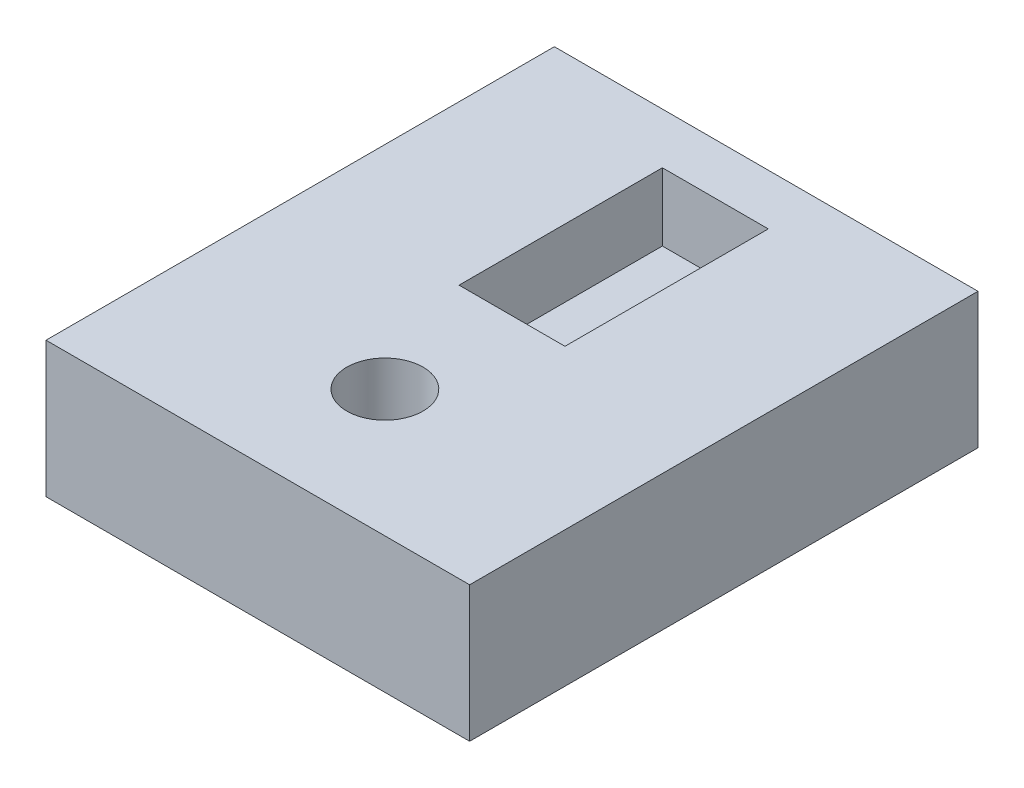
ISO-10303-21;
HEADER;
FILE_DESCRIPTION(('STEP AP214'),'2;1');
FILE_NAME('part.step','',(''),(''),'','','');
FILE_SCHEMA(('AUTOMOTIVE_DESIGN { 1 0 10303 214 1 1 1 1 }'));
ENDSEC;
DATA;
#1=APPLICATION_CONTEXT('core data for automotive mechanical design processes');
#2=APPLICATION_PROTOCOL_DEFINITION('international standard','automotive_design',2000,#1);
#3=PRODUCT_CONTEXT('',#1,'mechanical');
#4=PRODUCT('Part','Part','',(#3));
#5=PRODUCT_RELATED_PRODUCT_CATEGORY('part','',(#4));
#6=PRODUCT_DEFINITION_FORMATION('','',#4);
#7=PRODUCT_DEFINITION_CONTEXT('part definition',#1,'design');
#8=PRODUCT_DEFINITION('design','',#6,#7);
#9=PRODUCT_DEFINITION_SHAPE('','',#8);
#10=(LENGTH_UNIT() NAMED_UNIT(*) SI_UNIT(.MILLI.,.METRE.));
#11=(NAMED_UNIT(*) PLANE_ANGLE_UNIT() SI_UNIT($,.RADIAN.));
#12=(NAMED_UNIT(*) SI_UNIT($,.STERADIAN.) SOLID_ANGLE_UNIT());
#13=UNCERTAINTY_MEASURE_WITH_UNIT(LENGTH_MEASURE(1.E-05),#10,'distance_accuracy_value','');
#14=(GEOMETRIC_REPRESENTATION_CONTEXT(3) GLOBAL_UNCERTAINTY_ASSIGNED_CONTEXT((#13)) GLOBAL_UNIT_ASSIGNED_CONTEXT((#10,
#11,#12)) REPRESENTATION_CONTEXT('',''));
#15=CARTESIAN_POINT('',(0.,0.,0.));
#16=DIRECTION('',(0.,0.,1.));
#17=DIRECTION('',(1.,0.,0.));
#18=AXIS2_PLACEMENT_3D('',#15,#16,#17);
#19=CARTESIAN_POINT('',(-12.5,4.,15.));
#20=DIRECTION('',(1.,0.,0.));
#21=DIRECTION('',(0.,0.,-1.));
#22=AXIS2_PLACEMENT_3D('',#19,#20,#21);
#23=PLANE('',#22);
#24=DIRECTION('',(0.,-1.,0.));
#25=VECTOR('',#24,1.);
#26=CARTESIAN_POINT('',(-12.5,4.,-15.));
#27=LINE('',#26,#25);
#28=CARTESIAN_POINT('',(-12.5,4.,-15.));
#29=VERTEX_POINT('',#28);
#30=CARTESIAN_POINT('',(-12.5,-4.,-15.));
#31=VERTEX_POINT('',#30);
#32=EDGE_CURVE('E149',#29,#31,#27,.T.);
#33=ORIENTED_EDGE('',*,*,#32,.T.);
#34=DIRECTION('',(0.,0.,-1.));
#35=VECTOR('',#34,1.);
#36=CARTESIAN_POINT('',(-12.5,-4.,15.));
#37=LINE('',#36,#35);
#38=CARTESIAN_POINT('',(-12.5,-4.,15.));
#39=VERTEX_POINT('',#38);
#40=EDGE_CURVE('E11',#39,#31,#37,.T.);
#41=ORIENTED_EDGE('',*,*,#40,.F.);
#42=DIRECTION('',(0.,-1.,0.));
#43=VECTOR('',#42,1.);
#44=CARTESIAN_POINT('',(-12.5,4.,15.));
#45=LINE('',#44,#43);
#46=CARTESIAN_POINT('',(-12.5,4.,15.));
#47=VERTEX_POINT('',#46);
#48=EDGE_CURVE('E154',#47,#39,#45,.T.);
#49=ORIENTED_EDGE('',*,*,#48,.F.);
#50=DIRECTION('',(0.,0.,-1.));
#51=VECTOR('',#50,1.);
#52=CARTESIAN_POINT('',(-12.5,4.,15.));
#53=LINE('',#52,#51);
#54=EDGE_CURVE('E160',#47,#29,#53,.T.);
#55=ORIENTED_EDGE('',*,*,#54,.T.);
#56=EDGE_LOOP('',(#33,#41,#49,#55));
#57=FACE_BOUND('',#56,.T.);
#58=ADVANCED_FACE('F37',(#57),#23,.F.);
#59=CARTESIAN_POINT('',(-12.5,-4.,15.));
#60=DIRECTION('',(0.,1.,0.));
#61=DIRECTION('',(0.,0.,1.));
#62=AXIS2_PLACEMENT_3D('',#59,#60,#61);
#63=PLANE('',#62);
#64=CARTESIAN_POINT('',(0.,-4.,7.5));
#65=DIRECTION('',(0.,-1.,0.));
#66=DIRECTION('',(0.,0.,-1.));
#67=AXIS2_PLACEMENT_3D('',#64,#65,#66);
#68=CIRCLE('',#67,2.25);
#69=CARTESIAN_POINT('',(0.,-4.,5.25));
#70=VERTEX_POINT('',#69);
#71=EDGE_CURVE('E206',#70,#70,#68,.T.);
#72=ORIENTED_EDGE('',*,*,#71,.F.);
#73=EDGE_LOOP('',(#72));
#74=FACE_BOUND('',#73,.T.);
#75=DIRECTION('',(1.,0.,0.));
#76=VECTOR('',#75,1.);
#77=CARTESIAN_POINT('',(-12.5,-4.,-15.));
#78=LINE('',#77,#76);
#79=CARTESIAN_POINT('',(12.5,-4.,-15.));
#80=VERTEX_POINT('',#79);
#81=EDGE_CURVE('E163',#31,#80,#78,.T.);
#82=ORIENTED_EDGE('',*,*,#81,.T.);
#83=DIRECTION('',(0.,0.,-1.));
#84=VECTOR('',#83,1.);
#85=CARTESIAN_POINT('',(12.5,-4.,15.));
#86=LINE('',#85,#84);
#87=CARTESIAN_POINT('',(12.5,-4.,15.));
#88=VERTEX_POINT('',#87);
#89=EDGE_CURVE('E44',#88,#80,#86,.T.);
#90=ORIENTED_EDGE('',*,*,#89,.F.);
#91=DIRECTION('',(1.,0.,0.));
#92=VECTOR('',#91,1.);
#93=CARTESIAN_POINT('',(-12.5,-4.,15.));
#94=LINE('',#93,#92);
#95=EDGE_CURVE('E88',#39,#88,#94,.T.);
#96=ORIENTED_EDGE('',*,*,#95,.F.);
#97=ORIENTED_EDGE('',*,*,#40,.T.);
#98=EDGE_LOOP('',(#82,#90,#96,#97));
#99=FACE_BOUND('',#98,.T.);
#100=ADVANCED_FACE('F192',(#74,#99),#63,.F.);
#101=CARTESIAN_POINT('',(12.5,4.,15.));
#102=DIRECTION('',(-1.,0.,0.));
#103=DIRECTION('',(0.,0.,1.));
#104=AXIS2_PLACEMENT_3D('',#101,#102,#103);
#105=PLANE('',#104);
#106=DIRECTION('',(0.,1.,0.));
#107=VECTOR('',#106,1.);
#108=CARTESIAN_POINT('',(12.5,4.,-15.));
#109=LINE('',#108,#107);
#110=CARTESIAN_POINT('',(12.5,4.,-15.));
#111=VERTEX_POINT('',#110);
#112=EDGE_CURVE('E165',#80,#111,#109,.T.);
#113=ORIENTED_EDGE('',*,*,#112,.T.);
#114=DIRECTION('',(0.,0.,-1.));
#115=VECTOR('',#114,1.);
#116=CARTESIAN_POINT('',(12.5,4.,15.));
#117=LINE('',#116,#115);
#118=CARTESIAN_POINT('',(12.5,4.,15.));
#119=VERTEX_POINT('',#118);
#120=EDGE_CURVE('E169',#119,#111,#117,.T.);
#121=ORIENTED_EDGE('',*,*,#120,.F.);
#122=DIRECTION('',(0.,1.,0.));
#123=VECTOR('',#122,1.);
#124=CARTESIAN_POINT('',(12.5,4.,15.));
#125=LINE('',#124,#123);
#126=EDGE_CURVE('E157',#88,#119,#125,.T.);
#127=ORIENTED_EDGE('',*,*,#126,.F.);
#128=ORIENTED_EDGE('',*,*,#89,.T.);
#129=EDGE_LOOP('',(#113,#121,#127,#128));
#130=FACE_BOUND('',#129,.T.);
#131=ADVANCED_FACE('F174',(#130),#105,.F.);
#132=CARTESIAN_POINT('',(-12.5,4.,15.));
#133=DIRECTION('',(0.,-1.,0.));
#134=DIRECTION('',(0.,0.,-1.));
#135=AXIS2_PLACEMENT_3D('',#132,#133,#134);
#136=PLANE('',#135);
#137=CARTESIAN_POINT('',(0.,4.,7.5));
#138=DIRECTION('',(0.,-1.,0.));
#139=DIRECTION('',(0.,0.,-1.));
#140=AXIS2_PLACEMENT_3D('',#137,#138,#139);
#141=CIRCLE('',#140,2.25);
#142=CARTESIAN_POINT('',(0.,4.,5.25));
#143=VERTEX_POINT('',#142);
#144=EDGE_CURVE('E138',#143,#143,#141,.T.);
#145=ORIENTED_EDGE('',*,*,#144,.T.);
#146=EDGE_LOOP('',(#145));
#147=FACE_BOUND('',#146,.T.);
#148=DIRECTION('',(0.,0.,-1.));
#149=VECTOR('',#148,1.);
#150=CARTESIAN_POINT('',(3.125,4.,0.));
#151=LINE('',#150,#149);
#152=CARTESIAN_POINT('',(3.125,4.,0.));
#153=VERTEX_POINT('',#152);
#154=CARTESIAN_POINT('',(3.125,4.,-12.));
#155=VERTEX_POINT('',#154);
#156=EDGE_CURVE('E147',#153,#155,#151,.T.);
#157=ORIENTED_EDGE('',*,*,#156,.F.);
#158=DIRECTION('',(1.,0.,0.));
#159=VECTOR('',#158,1.);
#160=CARTESIAN_POINT('',(3.125,4.,0.));
#161=LINE('',#160,#159);
#162=CARTESIAN_POINT('',(-3.125,4.,0.));
#163=VERTEX_POINT('',#162);
#164=EDGE_CURVE('E119',#163,#153,#161,.T.);
#165=ORIENTED_EDGE('',*,*,#164,.F.);
#166=DIRECTION('',(0.,0.,-1.));
#167=VECTOR('',#166,1.);
#168=CARTESIAN_POINT('',(-3.125,4.,0.));
#169=LINE('',#168,#167);
#170=CARTESIAN_POINT('',(-3.125,4.,-12.));
#171=VERTEX_POINT('',#170);
#172=EDGE_CURVE('E150',#163,#171,#169,.T.);
#173=ORIENTED_EDGE('',*,*,#172,.T.);
#174=DIRECTION('',(1.,0.,0.));
#175=VECTOR('',#174,1.);
#176=CARTESIAN_POINT('',(3.125,4.,-12.));
#177=LINE('',#176,#175);
#178=EDGE_CURVE('E132',#171,#155,#177,.T.);
#179=ORIENTED_EDGE('',*,*,#178,.T.);
#180=EDGE_LOOP('',(#157,#165,#173,#179));
#181=FACE_BOUND('',#180,.T.);
#182=DIRECTION('',(-1.,0.,0.));
#183=VECTOR('',#182,1.);
#184=CARTESIAN_POINT('',(-12.5,4.,-15.));
#185=LINE('',#184,#183);
#186=EDGE_CURVE('E81',#111,#29,#185,.T.);
#187=ORIENTED_EDGE('',*,*,#186,.T.);
#188=ORIENTED_EDGE('',*,*,#54,.F.);
#189=DIRECTION('',(-1.,0.,0.));
#190=VECTOR('',#189,1.);
#191=CARTESIAN_POINT('',(-12.5,4.,15.));
#192=LINE('',#191,#190);
#193=EDGE_CURVE('E60',#119,#47,#192,.T.);
#194=ORIENTED_EDGE('',*,*,#193,.F.);
#195=ORIENTED_EDGE('',*,*,#120,.T.);
#196=EDGE_LOOP('',(#187,#188,#194,#195));
#197=FACE_BOUND('',#196,.T.);
#198=ADVANCED_FACE('F182',(#147,#181,#197),#136,.F.);
#199=CARTESIAN_POINT('',(0.,0.,15.));
#200=DIRECTION('',(0.,0.,1.));
#201=DIRECTION('',(1.,0.,0.));
#202=AXIS2_PLACEMENT_3D('',#199,#200,#201);
#203=PLANE('',#202);
#204=ORIENTED_EDGE('',*,*,#48,.T.);
#205=ORIENTED_EDGE('',*,*,#95,.T.);
#206=ORIENTED_EDGE('',*,*,#126,.T.);
#207=ORIENTED_EDGE('',*,*,#193,.T.);
#208=EDGE_LOOP('',(#204,#205,#206,#207));
#209=FACE_BOUND('',#208,.T.);
#210=ADVANCED_FACE('F184',(#209),#203,.T.);
#211=CARTESIAN_POINT('',(0.,0.,-15.));
#212=DIRECTION('',(0.,0.,1.));
#213=DIRECTION('',(1.,0.,0.));
#214=AXIS2_PLACEMENT_3D('',#211,#212,#213);
#215=PLANE('',#214);
#216=ORIENTED_EDGE('',*,*,#32,.F.);
#217=ORIENTED_EDGE('',*,*,#186,.F.);
#218=ORIENTED_EDGE('',*,*,#112,.F.);
#219=ORIENTED_EDGE('',*,*,#81,.F.);
#220=EDGE_LOOP('',(#216,#217,#218,#219));
#221=FACE_BOUND('',#220,.T.);
#222=ADVANCED_FACE('F178',(#221),#215,.F.);
#223=CARTESIAN_POINT('',(3.125,0.,0.));
#224=DIRECTION('',(1.,0.,0.));
#225=DIRECTION('',(0.,0.,-1.));
#226=AXIS2_PLACEMENT_3D('',#223,#224,#225);
#227=PLANE('',#226);
#228=DIRECTION('',(0.,-1.,0.));
#229=VECTOR('',#228,1.);
#230=CARTESIAN_POINT('',(3.125,0.,-12.));
#231=LINE('',#230,#229);
#232=CARTESIAN_POINT('',(3.125,0.,-12.));
#233=VERTEX_POINT('',#232);
#234=EDGE_CURVE('E51',#155,#233,#231,.T.);
#235=ORIENTED_EDGE('',*,*,#234,.T.);
#236=DIRECTION('',(0.,0.,-1.));
#237=VECTOR('',#236,1.);
#238=CARTESIAN_POINT('',(3.125,0.,0.));
#239=LINE('',#238,#237);
#240=CARTESIAN_POINT('',(3.125,0.,0.));
#241=VERTEX_POINT('',#240);
#242=EDGE_CURVE('E110',#241,#233,#239,.T.);
#243=ORIENTED_EDGE('',*,*,#242,.F.);
#244=DIRECTION('',(0.,-1.,0.));
#245=VECTOR('',#244,1.);
#246=CARTESIAN_POINT('',(3.125,0.,0.));
#247=LINE('',#246,#245);
#248=EDGE_CURVE('E114',#153,#241,#247,.T.);
#249=ORIENTED_EDGE('',*,*,#248,.F.);
#250=ORIENTED_EDGE('',*,*,#156,.T.);
#251=EDGE_LOOP('',(#235,#243,#249,#250));
#252=FACE_BOUND('',#251,.T.);
#253=ADVANCED_FACE('F112',(#252),#227,.F.);
#254=CARTESIAN_POINT('',(-3.125,0.,0.));
#255=DIRECTION('',(-1.,0.,0.));
#256=DIRECTION('',(0.,0.,1.));
#257=AXIS2_PLACEMENT_3D('',#254,#255,#256);
#258=PLANE('',#257);
#259=DIRECTION('',(0.,1.,0.));
#260=VECTOR('',#259,1.);
#261=CARTESIAN_POINT('',(-3.125,0.,-12.));
#262=LINE('',#261,#260);
#263=CARTESIAN_POINT('',(-3.125,0.,-12.));
#264=VERTEX_POINT('',#263);
#265=EDGE_CURVE('E135',#264,#171,#262,.T.);
#266=ORIENTED_EDGE('',*,*,#265,.T.);
#267=ORIENTED_EDGE('',*,*,#172,.F.);
#268=DIRECTION('',(0.,1.,0.));
#269=VECTOR('',#268,1.);
#270=CARTESIAN_POINT('',(-3.125,0.,0.));
#271=LINE('',#270,#269);
#272=CARTESIAN_POINT('',(-3.125,0.,0.));
#273=VERTEX_POINT('',#272);
#274=EDGE_CURVE('E127',#273,#163,#271,.T.);
#275=ORIENTED_EDGE('',*,*,#274,.F.);
#276=DIRECTION('',(0.,0.,-1.));
#277=VECTOR('',#276,1.);
#278=CARTESIAN_POINT('',(-3.125,0.,0.));
#279=LINE('',#278,#277);
#280=EDGE_CURVE('E118',#273,#264,#279,.T.);
#281=ORIENTED_EDGE('',*,*,#280,.T.);
#282=EDGE_LOOP('',(#266,#267,#275,#281));
#283=FACE_BOUND('',#282,.T.);
#284=ADVANCED_FACE('F221',(#283),#258,.F.);
#285=CARTESIAN_POINT('',(3.125,0.,0.));
#286=DIRECTION('',(0.,-1.,0.));
#287=DIRECTION('',(0.,0.,-1.));
#288=AXIS2_PLACEMENT_3D('',#285,#286,#287);
#289=PLANE('',#288);
#290=DIRECTION('',(-1.,0.,0.));
#291=VECTOR('',#290,1.);
#292=CARTESIAN_POINT('',(3.125,0.,-12.));
#293=LINE('',#292,#291);
#294=EDGE_CURVE('E144',#233,#264,#293,.T.);
#295=ORIENTED_EDGE('',*,*,#294,.T.);
#296=ORIENTED_EDGE('',*,*,#280,.F.);
#297=DIRECTION('',(-1.,0.,0.));
#298=VECTOR('',#297,1.);
#299=CARTESIAN_POINT('',(3.125,0.,0.));
#300=LINE('',#299,#298);
#301=EDGE_CURVE('E122',#241,#273,#300,.T.);
#302=ORIENTED_EDGE('',*,*,#301,.F.);
#303=ORIENTED_EDGE('',*,*,#242,.T.);
#304=EDGE_LOOP('',(#295,#296,#302,#303));
#305=FACE_BOUND('',#304,.T.);
#306=ADVANCED_FACE('F123',(#305),#289,.F.);
#307=CARTESIAN_POINT('',(0.,0.,0.));
#308=DIRECTION('',(0.,0.,1.));
#309=DIRECTION('',(1.,0.,0.));
#310=AXIS2_PLACEMENT_3D('',#307,#308,#309);
#311=PLANE('',#310);
#312=ORIENTED_EDGE('',*,*,#248,.T.);
#313=ORIENTED_EDGE('',*,*,#301,.T.);
#314=ORIENTED_EDGE('',*,*,#274,.T.);
#315=ORIENTED_EDGE('',*,*,#164,.T.);
#316=EDGE_LOOP('',(#312,#313,#314,#315));
#317=FACE_BOUND('',#316,.T.);
#318=ADVANCED_FACE('F129',(#317),#311,.F.);
#319=CARTESIAN_POINT('',(0.,0.,-12.));
#320=DIRECTION('',(0.,0.,1.));
#321=DIRECTION('',(1.,0.,0.));
#322=AXIS2_PLACEMENT_3D('',#319,#320,#321);
#323=PLANE('',#322);
#324=ORIENTED_EDGE('',*,*,#234,.F.);
#325=ORIENTED_EDGE('',*,*,#178,.F.);
#326=ORIENTED_EDGE('',*,*,#265,.F.);
#327=ORIENTED_EDGE('',*,*,#294,.F.);
#328=EDGE_LOOP('',(#324,#325,#326,#327));
#329=FACE_BOUND('',#328,.T.);
#330=ADVANCED_FACE('F212',(#329),#323,.T.);
#331=CARTESIAN_POINT('',(0.,-4.,7.5));
#332=DIRECTION('',(0.,-1.,0.));
#333=DIRECTION('',(0.,0.,-1.));
#334=AXIS2_PLACEMENT_3D('',#331,#332,#333);
#335=CYLINDRICAL_SURFACE('',#334,2.25);
#336=ORIENTED_EDGE('',*,*,#144,.F.);
#337=EDGE_LOOP('',(#336));
#338=FACE_BOUND('',#337,.T.);
#339=ORIENTED_EDGE('',*,*,#71,.T.);
#340=EDGE_LOOP('',(#339));
#341=FACE_BOUND('',#340,.T.);
#342=ADVANCED_FACE('F210',(#338,#341),#335,.F.);
#343=CLOSED_SHELL('',(#58,#100,#131,#198,#210,#222,#253,#284,#306,#318,#330,#342));
#344=MANIFOLD_SOLID_BREP('B2',#343);
#345=ADVANCED_BREP_SHAPE_REPRESENTATION('',(#18,#344),#14);
#346=SHAPE_DEFINITION_REPRESENTATION(#9,#345);
ENDSEC;
END-ISO-10303-21;
